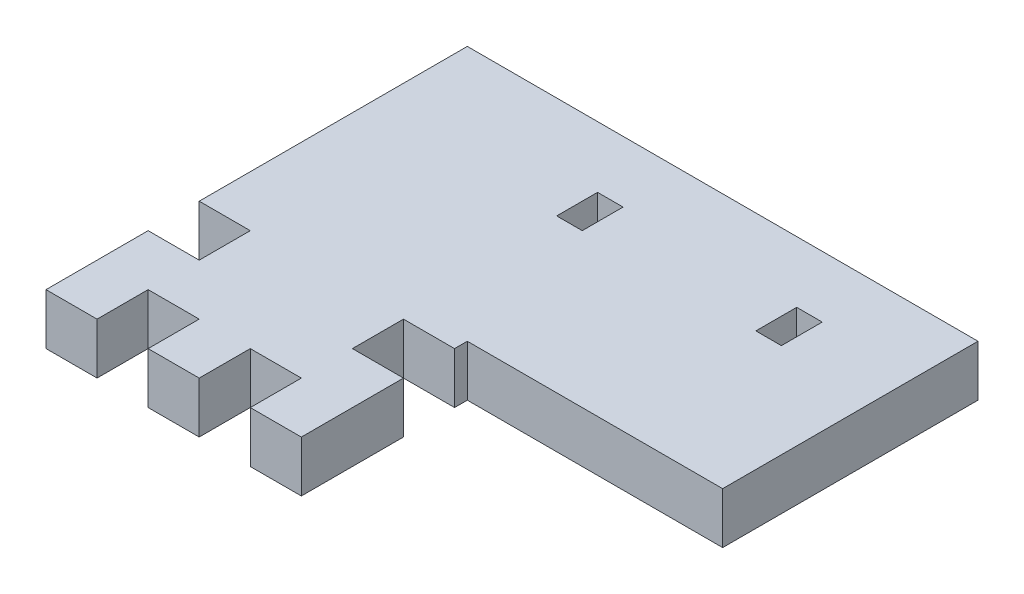
ISO-10303-21;
HEADER;
FILE_DESCRIPTION(('STEP AP214'),'2;1');
FILE_NAME('part.step','',(''),(''),'','','');
FILE_SCHEMA(('AUTOMOTIVE_DESIGN { 1 0 10303 214 1 1 1 1 }'));
ENDSEC;
DATA;
#1=APPLICATION_CONTEXT('core data for automotive mechanical design processes');
#2=APPLICATION_PROTOCOL_DEFINITION('international standard','automotive_design',2000,#1);
#3=PRODUCT_CONTEXT('',#1,'mechanical');
#4=PRODUCT('Part','Part','',(#3));
#5=PRODUCT_RELATED_PRODUCT_CATEGORY('part','',(#4));
#6=PRODUCT_DEFINITION_FORMATION('','',#4);
#7=PRODUCT_DEFINITION_CONTEXT('part definition',#1,'design');
#8=PRODUCT_DEFINITION('design','',#6,#7);
#9=PRODUCT_DEFINITION_SHAPE('','',#8);
#10=(LENGTH_UNIT() NAMED_UNIT(*) SI_UNIT(.MILLI.,.METRE.));
#11=(NAMED_UNIT(*) PLANE_ANGLE_UNIT() SI_UNIT($,.RADIAN.));
#12=(NAMED_UNIT(*) SI_UNIT($,.STERADIAN.) SOLID_ANGLE_UNIT());
#13=UNCERTAINTY_MEASURE_WITH_UNIT(LENGTH_MEASURE(1.E-05),#10,'distance_accuracy_value','');
#14=(GEOMETRIC_REPRESENTATION_CONTEXT(3) GLOBAL_UNCERTAINTY_ASSIGNED_CONTEXT((#13)) GLOBAL_UNIT_ASSIGNED_CONTEXT((#10,
#11,#12)) REPRESENTATION_CONTEXT('',''));
#15=CARTESIAN_POINT('',(0.,0.,0.));
#16=DIRECTION('',(0.,0.,1.));
#17=DIRECTION('',(1.,0.,0.));
#18=AXIS2_PLACEMENT_3D('',#15,#16,#17);
#19=CARTESIAN_POINT('',(12.7,2.54,-8.255));
#20=DIRECTION('',(-1.,0.,0.));
#21=DIRECTION('',(0.,0.,1.));
#22=AXIS2_PLACEMENT_3D('',#19,#20,#21);
#23=PLANE('',#22);
#24=DIRECTION('',(0.,0.,-1.));
#25=VECTOR('',#24,1.);
#26=CARTESIAN_POINT('',(12.7,0.,-8.255));
#27=LINE('',#26,#25);
#28=CARTESIAN_POINT('',(12.7,0.,0.));
#29=VERTEX_POINT('',#28);
#30=CARTESIAN_POINT('',(12.7,0.,-5.08));
#31=VERTEX_POINT('',#30);
#32=EDGE_CURVE('E255',#29,#31,#27,.T.);
#33=ORIENTED_EDGE('',*,*,#32,.T.);
#34=DIRECTION('',(0.,1.,0.));
#35=VECTOR('',#34,1.);
#36=CARTESIAN_POINT('',(12.7,0.,-5.08));
#37=LINE('',#36,#35);
#38=CARTESIAN_POINT('',(12.7,2.54,-5.08));
#39=VERTEX_POINT('',#38);
#40=EDGE_CURVE('E342',#31,#39,#37,.T.);
#41=ORIENTED_EDGE('',*,*,#40,.T.);
#42=DIRECTION('',(0.,0.,-1.));
#43=VECTOR('',#42,1.);
#44=CARTESIAN_POINT('',(12.7,2.54,-8.255));
#45=LINE('',#44,#43);
#46=CARTESIAN_POINT('',(12.7,2.54,0.));
#47=VERTEX_POINT('',#46);
#48=EDGE_CURVE('E295',#47,#39,#45,.T.);
#49=ORIENTED_EDGE('',*,*,#48,.F.);
#50=DIRECTION('',(0.,-1.,0.));
#51=VECTOR('',#50,1.);
#52=CARTESIAN_POINT('',(12.7,2.54,0.));
#53=LINE('',#52,#51);
#54=EDGE_CURVE('E11',#47,#29,#53,.T.);
#55=ORIENTED_EDGE('',*,*,#54,.T.);
#56=EDGE_LOOP('',(#33,#41,#49,#55));
#57=FACE_BOUND('',#56,.T.);
#58=ADVANCED_FACE('F33',(#57),#23,.F.);
#59=CARTESIAN_POINT('',(0.,2.54,0.));
#60=DIRECTION('',(1.,0.,0.));
#61=DIRECTION('',(0.,0.,-1.));
#62=AXIS2_PLACEMENT_3D('',#59,#60,#61);
#63=PLANE('',#62);
#64=DIRECTION('',(0.,0.,1.));
#65=VECTOR('',#64,1.);
#66=CARTESIAN_POINT('',(0.,0.,0.));
#67=LINE('',#66,#65);
#68=CARTESIAN_POINT('',(0.,0.,-20.955));
#69=VERTEX_POINT('',#68);
#70=CARTESIAN_POINT('',(0.,0.,-7.62));
#71=VERTEX_POINT('',#70);
#72=EDGE_CURVE('E271',#69,#71,#67,.T.);
#73=ORIENTED_EDGE('',*,*,#72,.T.);
#74=DIRECTION('',(0.,1.,0.));
#75=VECTOR('',#74,1.);
#76=CARTESIAN_POINT('',(0.,0.,-7.62));
#77=LINE('',#76,#75);
#78=CARTESIAN_POINT('',(0.,2.54,-7.62));
#79=VERTEX_POINT('',#78);
#80=EDGE_CURVE('E377',#71,#79,#77,.T.);
#81=ORIENTED_EDGE('',*,*,#80,.T.);
#82=DIRECTION('',(0.,0.,1.));
#83=VECTOR('',#82,1.);
#84=CARTESIAN_POINT('',(0.,2.54,0.));
#85=LINE('',#84,#83);
#86=CARTESIAN_POINT('',(0.,2.54,-20.955));
#87=VERTEX_POINT('',#86);
#88=EDGE_CURVE('E279',#87,#79,#85,.T.);
#89=ORIENTED_EDGE('',*,*,#88,.F.);
#90=DIRECTION('',(0.,-1.,0.));
#91=VECTOR('',#90,1.);
#92=CARTESIAN_POINT('',(0.,2.54,-20.955));
#93=LINE('',#92,#91);
#94=EDGE_CURVE('E278',#87,#69,#93,.T.);
#95=ORIENTED_EDGE('',*,*,#94,.T.);
#96=EDGE_LOOP('',(#73,#81,#89,#95));
#97=FACE_BOUND('',#96,.T.);
#98=ADVANCED_FACE('F525',(#97),#63,.F.);
#99=CARTESIAN_POINT('',(12.7,2.54,0.));
#100=DIRECTION('',(0.,0.,-1.));
#101=DIRECTION('',(-1.,0.,0.));
#102=AXIS2_PLACEMENT_3D('',#99,#100,#101);
#103=PLANE('',#102);
#104=DIRECTION('',(1.,0.,0.));
#105=VECTOR('',#104,1.);
#106=CARTESIAN_POINT('',(12.7,0.,0.));
#107=LINE('',#106,#105);
#108=CARTESIAN_POINT('',(5.08,0.,0.));
#109=VERTEX_POINT('',#108);
#110=CARTESIAN_POINT('',(7.62,0.,0.));
#111=VERTEX_POINT('',#110);
#112=EDGE_CURVE('E260',#109,#111,#107,.T.);
#113=ORIENTED_EDGE('',*,*,#112,.T.);
#114=DIRECTION('',(0.,1.,0.));
#115=VECTOR('',#114,1.);
#116=CARTESIAN_POINT('',(7.62,0.,0.));
#117=LINE('',#116,#115);
#118=CARTESIAN_POINT('',(7.62,2.54,0.));
#119=VERTEX_POINT('',#118);
#120=EDGE_CURVE('E459',#111,#119,#117,.T.);
#121=ORIENTED_EDGE('',*,*,#120,.T.);
#122=DIRECTION('',(1.,0.,0.));
#123=VECTOR('',#122,1.);
#124=CARTESIAN_POINT('',(12.7,2.54,0.));
#125=LINE('',#124,#123);
#126=CARTESIAN_POINT('',(5.08,2.54,0.));
#127=VERTEX_POINT('',#126);
#128=EDGE_CURVE('E327',#127,#119,#125,.T.);
#129=ORIENTED_EDGE('',*,*,#128,.F.);
#130=DIRECTION('',(0.,1.,0.));
#131=VECTOR('',#130,1.);
#132=CARTESIAN_POINT('',(5.08,0.,0.));
#133=LINE('',#132,#131);
#134=EDGE_CURVE('E491',#109,#127,#133,.T.);
#135=ORIENTED_EDGE('',*,*,#134,.F.);
#136=EDGE_LOOP('',(#113,#121,#129,#135));
#137=FACE_BOUND('',#136,.T.);
#138=ADVANCED_FACE('F503',(#137),#103,.F.);
#139=CARTESIAN_POINT('',(0.,0.,0.));
#140=VERTEX_POINT('',#139);
#141=CARTESIAN_POINT('',(2.54,0.,0.));
#142=VERTEX_POINT('',#141);
#143=EDGE_CURVE('E256',#140,#142,#107,.T.);
#144=ORIENTED_EDGE('',*,*,#143,.T.);
#145=DIRECTION('',(0.,1.,0.));
#146=VECTOR('',#145,1.);
#147=CARTESIAN_POINT('',(2.54,0.,0.));
#148=LINE('',#147,#146);
#149=CARTESIAN_POINT('',(2.54,2.54,0.));
#150=VERTEX_POINT('',#149);
#151=EDGE_CURVE('E326',#142,#150,#148,.T.);
#152=ORIENTED_EDGE('',*,*,#151,.T.);
#153=CARTESIAN_POINT('',(0.,2.54,0.));
#154=VERTEX_POINT('',#153);
#155=EDGE_CURVE('E314',#154,#150,#125,.T.);
#156=ORIENTED_EDGE('',*,*,#155,.F.);
#157=DIRECTION('',(0.,-1.,0.));
#158=VECTOR('',#157,1.);
#159=CARTESIAN_POINT('',(0.,2.54,0.));
#160=LINE('',#159,#158);
#161=EDGE_CURVE('E275',#154,#140,#160,.T.);
#162=ORIENTED_EDGE('',*,*,#161,.T.);
#163=EDGE_LOOP('',(#144,#152,#156,#162));
#164=FACE_BOUND('',#163,.T.);
#165=ADVANCED_FACE('F325',(#164),#103,.F.);
#166=CARTESIAN_POINT('',(10.16,2.54,0.));
#167=VERTEX_POINT('',#166);
#168=EDGE_CURVE('E274',#167,#47,#125,.T.);
#169=ORIENTED_EDGE('',*,*,#168,.F.);
#170=DIRECTION('',(0.,1.,0.));
#171=VECTOR('',#170,1.);
#172=CARTESIAN_POINT('',(10.16,0.,0.));
#173=LINE('',#172,#171);
#174=CARTESIAN_POINT('',(10.16,0.,0.));
#175=VERTEX_POINT('',#174);
#176=EDGE_CURVE('E345',#175,#167,#173,.T.);
#177=ORIENTED_EDGE('',*,*,#176,.F.);
#178=EDGE_CURVE('E262',#175,#29,#107,.T.);
#179=ORIENTED_EDGE('',*,*,#178,.T.);
#180=ORIENTED_EDGE('',*,*,#54,.F.);
#181=EDGE_LOOP('',(#169,#177,#179,#180));
#182=FACE_BOUND('',#181,.T.);
#183=ADVANCED_FACE('F35',(#182),#103,.F.);
#184=CARTESIAN_POINT('',(12.7,2.54,-7.62));
#185=VERTEX_POINT('',#184);
#186=CARTESIAN_POINT('',(12.7,2.54,-8.255));
#187=VERTEX_POINT('',#186);
#188=EDGE_CURVE('E246',#185,#187,#45,.T.);
#189=ORIENTED_EDGE('',*,*,#188,.F.);
#190=DIRECTION('',(0.,1.,0.));
#191=VECTOR('',#190,1.);
#192=CARTESIAN_POINT('',(12.7,0.,-7.62));
#193=LINE('',#192,#191);
#194=CARTESIAN_POINT('',(12.7,0.,-7.62));
#195=VERTEX_POINT('',#194);
#196=EDGE_CURVE('E233',#195,#185,#193,.T.);
#197=ORIENTED_EDGE('',*,*,#196,.F.);
#198=CARTESIAN_POINT('',(12.7,0.,-8.255));
#199=VERTEX_POINT('',#198);
#200=EDGE_CURVE('E244',#195,#199,#27,.T.);
#201=ORIENTED_EDGE('',*,*,#200,.T.);
#202=DIRECTION('',(0.,-1.,0.));
#203=VECTOR('',#202,1.);
#204=CARTESIAN_POINT('',(12.7,2.54,-8.255));
#205=LINE('',#204,#203);
#206=EDGE_CURVE('E41',#187,#199,#205,.T.);
#207=ORIENTED_EDGE('',*,*,#206,.F.);
#208=EDGE_LOOP('',(#189,#197,#201,#207));
#209=FACE_BOUND('',#208,.T.);
#210=ADVANCED_FACE('F242',(#209),#23,.F.);
#211=CARTESIAN_POINT('',(25.4,2.54,-8.255));
#212=DIRECTION('',(0.,0.,-1.));
#213=DIRECTION('',(-1.,0.,0.));
#214=AXIS2_PLACEMENT_3D('',#211,#212,#213);
#215=PLANE('',#214);
#216=DIRECTION('',(1.,0.,0.));
#217=VECTOR('',#216,1.);
#218=CARTESIAN_POINT('',(25.4,0.,-8.255));
#219=LINE('',#218,#217);
#220=CARTESIAN_POINT('',(25.4,0.,-8.255));
#221=VERTEX_POINT('',#220);
#222=EDGE_CURVE('E254',#199,#221,#219,.T.);
#223=ORIENTED_EDGE('',*,*,#222,.T.);
#224=DIRECTION('',(0.,-1.,0.));
#225=VECTOR('',#224,1.);
#226=CARTESIAN_POINT('',(25.4,2.54,-8.255));
#227=LINE('',#226,#225);
#228=CARTESIAN_POINT('',(25.4,2.54,-8.255));
#229=VERTEX_POINT('',#228);
#230=EDGE_CURVE('E285',#229,#221,#227,.T.);
#231=ORIENTED_EDGE('',*,*,#230,.F.);
#232=DIRECTION('',(1.,0.,0.));
#233=VECTOR('',#232,1.);
#234=CARTESIAN_POINT('',(25.4,2.54,-8.255));
#235=LINE('',#234,#233);
#236=EDGE_CURVE('E291',#187,#229,#235,.T.);
#237=ORIENTED_EDGE('',*,*,#236,.F.);
#238=ORIENTED_EDGE('',*,*,#206,.T.);
#239=EDGE_LOOP('',(#223,#231,#237,#238));
#240=FACE_BOUND('',#239,.T.);
#241=ADVANCED_FACE('F289',(#240),#215,.F.);
#242=CARTESIAN_POINT('',(25.4,2.54,-20.955));
#243=DIRECTION('',(-1.,0.,0.));
#244=DIRECTION('',(0.,0.,1.));
#245=AXIS2_PLACEMENT_3D('',#242,#243,#244);
#246=PLANE('',#245);
#247=DIRECTION('',(0.,0.,-1.));
#248=VECTOR('',#247,1.);
#249=CARTESIAN_POINT('',(25.4,0.,-20.955));
#250=LINE('',#249,#248);
#251=CARTESIAN_POINT('',(25.4,0.,-20.955));
#252=VERTEX_POINT('',#251);
#253=EDGE_CURVE('E266',#221,#252,#250,.T.);
#254=ORIENTED_EDGE('',*,*,#253,.T.);
#255=DIRECTION('',(0.,-1.,0.));
#256=VECTOR('',#255,1.);
#257=CARTESIAN_POINT('',(25.4,2.54,-20.955));
#258=LINE('',#257,#256);
#259=CARTESIAN_POINT('',(25.4,2.54,-20.955));
#260=VERTEX_POINT('',#259);
#261=EDGE_CURVE('E282',#260,#252,#258,.T.);
#262=ORIENTED_EDGE('',*,*,#261,.F.);
#263=DIRECTION('',(0.,0.,-1.));
#264=VECTOR('',#263,1.);
#265=CARTESIAN_POINT('',(25.4,2.54,-20.955));
#266=LINE('',#265,#264);
#267=EDGE_CURVE('E294',#229,#260,#266,.T.);
#268=ORIENTED_EDGE('',*,*,#267,.F.);
#269=ORIENTED_EDGE('',*,*,#230,.T.);
#270=EDGE_LOOP('',(#254,#262,#268,#269));
#271=FACE_BOUND('',#270,.T.);
#272=ADVANCED_FACE('F537',(#271),#246,.F.);
#273=CARTESIAN_POINT('',(0.,2.54,-20.955));
#274=DIRECTION('',(0.,0.,1.));
#275=DIRECTION('',(1.,0.,0.));
#276=AXIS2_PLACEMENT_3D('',#273,#274,#275);
#277=PLANE('',#276);
#278=DIRECTION('',(-1.,0.,0.));
#279=VECTOR('',#278,1.);
#280=CARTESIAN_POINT('',(0.,0.,-20.955));
#281=LINE('',#280,#279);
#282=EDGE_CURVE('E268',#252,#69,#281,.T.);
#283=ORIENTED_EDGE('',*,*,#282,.T.);
#284=ORIENTED_EDGE('',*,*,#94,.F.);
#285=DIRECTION('',(-1.,0.,0.));
#286=VECTOR('',#285,1.);
#287=CARTESIAN_POINT('',(0.,2.54,-20.955));
#288=LINE('',#287,#286);
#289=EDGE_CURVE('E297',#260,#87,#288,.T.);
#290=ORIENTED_EDGE('',*,*,#289,.F.);
#291=ORIENTED_EDGE('',*,*,#261,.T.);
#292=EDGE_LOOP('',(#283,#284,#290,#291));
#293=FACE_BOUND('',#292,.T.);
#294=ADVANCED_FACE('F573',(#293),#277,.F.);
#295=CARTESIAN_POINT('',(0.,2.54,-5.08));
#296=VERTEX_POINT('',#295);
#297=EDGE_CURVE('E303',#296,#154,#85,.T.);
#298=ORIENTED_EDGE('',*,*,#297,.F.);
#299=DIRECTION('',(0.,1.,0.));
#300=VECTOR('',#299,1.);
#301=CARTESIAN_POINT('',(0.,0.,-5.08));
#302=LINE('',#301,#300);
#303=CARTESIAN_POINT('',(0.,0.,-5.08));
#304=VERTEX_POINT('',#303);
#305=EDGE_CURVE('E371',#304,#296,#302,.T.);
#306=ORIENTED_EDGE('',*,*,#305,.F.);
#307=EDGE_CURVE('E270',#304,#140,#67,.T.);
#308=ORIENTED_EDGE('',*,*,#307,.T.);
#309=ORIENTED_EDGE('',*,*,#161,.F.);
#310=EDGE_LOOP('',(#298,#306,#308,#309));
#311=FACE_BOUND('',#310,.T.);
#312=ADVANCED_FACE('F320',(#311),#63,.F.);
#313=CARTESIAN_POINT('',(0.,2.54,0.));
#314=DIRECTION('',(0.,-1.,0.));
#315=DIRECTION('',(0.,0.,-1.));
#316=AXIS2_PLACEMENT_3D('',#313,#314,#315);
#317=PLANE('',#316);
#318=DIRECTION('',(1.,0.,0.));
#319=VECTOR('',#318,1.);
#320=CARTESIAN_POINT('',(19.431,2.54,-15.875));
#321=LINE('',#320,#319);
#322=CARTESIAN_POINT('',(19.431,2.54,-15.875));
#323=VERTEX_POINT('',#322);
#324=CARTESIAN_POINT('',(20.701,2.54,-15.875));
#325=VERTEX_POINT('',#324);
#326=EDGE_CURVE('E401',#323,#325,#321,.T.);
#327=ORIENTED_EDGE('',*,*,#326,.F.);
#328=DIRECTION('',(0.,0.,1.));
#329=VECTOR('',#328,1.);
#330=CARTESIAN_POINT('',(19.431,2.54,-15.875));
#331=LINE('',#330,#329);
#332=CARTESIAN_POINT('',(19.431,2.54,-17.907));
#333=VERTEX_POINT('',#332);
#334=EDGE_CURVE('E380',#333,#323,#331,.T.);
#335=ORIENTED_EDGE('',*,*,#334,.F.);
#336=DIRECTION('',(-1.,0.,0.));
#337=VECTOR('',#336,1.);
#338=CARTESIAN_POINT('',(19.431,2.54,-17.907));
#339=LINE('',#338,#337);
#340=CARTESIAN_POINT('',(20.701,2.54,-17.907));
#341=VERTEX_POINT('',#340);
#342=EDGE_CURVE('E390',#341,#333,#339,.T.);
#343=ORIENTED_EDGE('',*,*,#342,.F.);
#344=DIRECTION('',(0.,0.,-1.));
#345=VECTOR('',#344,1.);
#346=CARTESIAN_POINT('',(20.701,2.54,-15.875));
#347=LINE('',#346,#345);
#348=EDGE_CURVE('E404',#325,#341,#347,.T.);
#349=ORIENTED_EDGE('',*,*,#348,.F.);
#350=EDGE_LOOP('',(#327,#335,#343,#349));
#351=FACE_BOUND('',#350,.T.);
#352=DIRECTION('',(1.,0.,0.));
#353=VECTOR('',#352,1.);
#354=CARTESIAN_POINT('',(9.525,2.54,-15.875));
#355=LINE('',#354,#353);
#356=CARTESIAN_POINT('',(9.525,2.54,-15.875));
#357=VERTEX_POINT('',#356);
#358=CARTESIAN_POINT('',(10.795,2.54,-15.875));
#359=VERTEX_POINT('',#358);
#360=EDGE_CURVE('E433',#357,#359,#355,.T.);
#361=ORIENTED_EDGE('',*,*,#360,.F.);
#362=DIRECTION('',(0.,0.,1.));
#363=VECTOR('',#362,1.);
#364=CARTESIAN_POINT('',(9.525,2.54,-15.875));
#365=LINE('',#364,#363);
#366=CARTESIAN_POINT('',(9.525,2.54,-17.907));
#367=VERTEX_POINT('',#366);
#368=EDGE_CURVE('E411',#367,#357,#365,.T.);
#369=ORIENTED_EDGE('',*,*,#368,.F.);
#370=DIRECTION('',(-1.,0.,0.));
#371=VECTOR('',#370,1.);
#372=CARTESIAN_POINT('',(9.525,2.54,-17.907));
#373=LINE('',#372,#371);
#374=CARTESIAN_POINT('',(10.795,2.54,-17.907));
#375=VERTEX_POINT('',#374);
#376=EDGE_CURVE('E422',#375,#367,#373,.T.);
#377=ORIENTED_EDGE('',*,*,#376,.F.);
#378=DIRECTION('',(0.,0.,-1.));
#379=VECTOR('',#378,1.);
#380=CARTESIAN_POINT('',(10.795,2.54,-15.875));
#381=LINE('',#380,#379);
#382=EDGE_CURVE('E436',#359,#375,#381,.T.);
#383=ORIENTED_EDGE('',*,*,#382,.F.);
#384=EDGE_LOOP('',(#361,#369,#377,#383));
#385=FACE_BOUND('',#384,.T.);
#386=ORIENTED_EDGE('',*,*,#48,.T.);
#387=DIRECTION('',(1.,0.,0.));
#388=VECTOR('',#387,1.);
#389=CARTESIAN_POINT('',(12.7,2.54,-5.08));
#390=LINE('',#389,#388);
#391=CARTESIAN_POINT('',(10.16,2.54,-5.08));
#392=VERTEX_POINT('',#391);
#393=EDGE_CURVE('E238',#392,#39,#390,.T.);
#394=ORIENTED_EDGE('',*,*,#393,.F.);
#395=DIRECTION('',(0.,0.,1.));
#396=VECTOR('',#395,1.);
#397=CARTESIAN_POINT('',(10.16,2.54,-7.62));
#398=LINE('',#397,#396);
#399=CARTESIAN_POINT('',(10.16,2.54,-7.62));
#400=VERTEX_POINT('',#399);
#401=EDGE_CURVE('E355',#400,#392,#398,.T.);
#402=ORIENTED_EDGE('',*,*,#401,.F.);
#403=DIRECTION('',(-1.,0.,0.));
#404=VECTOR('',#403,1.);
#405=CARTESIAN_POINT('',(12.7,2.54,-7.62));
#406=LINE('',#405,#404);
#407=EDGE_CURVE('E353',#185,#400,#406,.T.);
#408=ORIENTED_EDGE('',*,*,#407,.F.);
#409=ORIENTED_EDGE('',*,*,#188,.T.);
#410=ORIENTED_EDGE('',*,*,#236,.T.);
#411=ORIENTED_EDGE('',*,*,#267,.T.);
#412=ORIENTED_EDGE('',*,*,#289,.T.);
#413=ORIENTED_EDGE('',*,*,#88,.T.);
#414=DIRECTION('',(-1.,0.,0.));
#415=VECTOR('',#414,1.);
#416=CARTESIAN_POINT('',(0.,2.54,-7.62));
#417=LINE('',#416,#415);
#418=CARTESIAN_POINT('',(2.54,2.54,-7.62));
#419=VERTEX_POINT('',#418);
#420=EDGE_CURVE('E366',#419,#79,#417,.T.);
#421=ORIENTED_EDGE('',*,*,#420,.F.);
#422=DIRECTION('',(0.,0.,-1.));
#423=VECTOR('',#422,1.);
#424=CARTESIAN_POINT('',(2.54,2.54,-7.62));
#425=LINE('',#424,#423);
#426=CARTESIAN_POINT('',(2.54,2.54,-5.08));
#427=VERTEX_POINT('',#426);
#428=EDGE_CURVE('E373',#427,#419,#425,.T.);
#429=ORIENTED_EDGE('',*,*,#428,.F.);
#430=DIRECTION('',(1.,0.,0.));
#431=VECTOR('',#430,1.);
#432=CARTESIAN_POINT('',(0.,2.54,-5.08));
#433=LINE('',#432,#431);
#434=EDGE_CURVE('E317',#296,#427,#433,.T.);
#435=ORIENTED_EDGE('',*,*,#434,.F.);
#436=ORIENTED_EDGE('',*,*,#297,.T.);
#437=ORIENTED_EDGE('',*,*,#155,.T.);
#438=DIRECTION('',(0.,0.,1.));
#439=VECTOR('',#438,1.);
#440=CARTESIAN_POINT('',(2.54,2.54,0.));
#441=LINE('',#440,#439);
#442=CARTESIAN_POINT('',(2.54,2.54,-2.54));
#443=VERTEX_POINT('',#442);
#444=EDGE_CURVE('E466',#443,#150,#441,.T.);
#445=ORIENTED_EDGE('',*,*,#444,.F.);
#446=DIRECTION('',(-1.,0.,0.));
#447=VECTOR('',#446,1.);
#448=CARTESIAN_POINT('',(2.54,2.54,-2.54));
#449=LINE('',#448,#447);
#450=CARTESIAN_POINT('',(5.08,2.54,-2.54));
#451=VERTEX_POINT('',#450);
#452=EDGE_CURVE('E476',#451,#443,#449,.T.);
#453=ORIENTED_EDGE('',*,*,#452,.F.);
#454=DIRECTION('',(0.,0.,-1.));
#455=VECTOR('',#454,1.);
#456=CARTESIAN_POINT('',(5.08,2.54,0.));
#457=LINE('',#456,#455);
#458=EDGE_CURVE('E483',#127,#451,#457,.T.);
#459=ORIENTED_EDGE('',*,*,#458,.F.);
#460=ORIENTED_EDGE('',*,*,#128,.T.);
#461=DIRECTION('',(0.,0.,1.));
#462=VECTOR('',#461,1.);
#463=CARTESIAN_POINT('',(7.62,2.54,0.));
#464=LINE('',#463,#462);
#465=CARTESIAN_POINT('',(7.62,2.54,-2.54));
#466=VERTEX_POINT('',#465);
#467=EDGE_CURVE('E443',#466,#119,#464,.T.);
#468=ORIENTED_EDGE('',*,*,#467,.F.);
#469=DIRECTION('',(-1.,0.,0.));
#470=VECTOR('',#469,1.);
#471=CARTESIAN_POINT('',(7.62,2.54,-2.54));
#472=LINE('',#471,#470);
#473=CARTESIAN_POINT('',(10.16,2.54,-2.54));
#474=VERTEX_POINT('',#473);
#475=EDGE_CURVE('E454',#474,#466,#472,.T.);
#476=ORIENTED_EDGE('',*,*,#475,.F.);
#477=DIRECTION('',(0.,0.,-1.));
#478=VECTOR('',#477,1.);
#479=CARTESIAN_POINT('',(10.16,2.54,0.));
#480=LINE('',#479,#478);
#481=EDGE_CURVE('E336',#167,#474,#480,.T.);
#482=ORIENTED_EDGE('',*,*,#481,.F.);
#483=ORIENTED_EDGE('',*,*,#168,.T.);
#484=EDGE_LOOP('',(#386,#394,#402,#408,#409,#410,#411,#412,#413,#421,#429,#435,#436,#437,#445,
#453,#459,#460,#468,#476,#482,#483));
#485=FACE_BOUND('',#484,.T.);
#486=ADVANCED_FACE('F311',(#351,#385,#485),#317,.F.);
#487=CARTESIAN_POINT('',(0.,0.,0.));
#488=DIRECTION('',(0.,-1.,0.));
#489=DIRECTION('',(0.,0.,-1.));
#490=AXIS2_PLACEMENT_3D('',#487,#488,#489);
#491=PLANE('',#490);
#492=DIRECTION('',(1.,0.,0.));
#493=VECTOR('',#492,1.);
#494=CARTESIAN_POINT('',(12.7,0.,-5.08));
#495=LINE('',#494,#493);
#496=CARTESIAN_POINT('',(10.16,0.,-5.08));
#497=VERTEX_POINT('',#496);
#498=EDGE_CURVE('E247',#497,#31,#495,.T.);
#499=ORIENTED_EDGE('',*,*,#498,.T.);
#500=ORIENTED_EDGE('',*,*,#32,.F.);
#501=ORIENTED_EDGE('',*,*,#178,.F.);
#502=DIRECTION('',(0.,0.,-1.));
#503=VECTOR('',#502,1.);
#504=CARTESIAN_POINT('',(10.16,0.,0.));
#505=LINE('',#504,#503);
#506=CARTESIAN_POINT('',(10.16,0.,-2.54));
#507=VERTEX_POINT('',#506);
#508=EDGE_CURVE('E453',#175,#507,#505,.T.);
#509=ORIENTED_EDGE('',*,*,#508,.T.);
#510=DIRECTION('',(-1.,0.,0.));
#511=VECTOR('',#510,1.);
#512=CARTESIAN_POINT('',(7.62,0.,-2.54));
#513=LINE('',#512,#511);
#514=CARTESIAN_POINT('',(7.62,0.,-2.54));
#515=VERTEX_POINT('',#514);
#516=EDGE_CURVE('E456',#507,#515,#513,.T.);
#517=ORIENTED_EDGE('',*,*,#516,.T.);
#518=DIRECTION('',(0.,0.,1.));
#519=VECTOR('',#518,1.);
#520=CARTESIAN_POINT('',(7.62,0.,0.));
#521=LINE('',#520,#519);
#522=EDGE_CURVE('E450',#515,#111,#521,.T.);
#523=ORIENTED_EDGE('',*,*,#522,.T.);
#524=ORIENTED_EDGE('',*,*,#112,.F.);
#525=DIRECTION('',(0.,0.,-1.));
#526=VECTOR('',#525,1.);
#527=CARTESIAN_POINT('',(5.08,0.,0.));
#528=LINE('',#527,#526);
#529=CARTESIAN_POINT('',(5.08,0.,-2.54));
#530=VERTEX_POINT('',#529);
#531=EDGE_CURVE('E475',#109,#530,#528,.T.);
#532=ORIENTED_EDGE('',*,*,#531,.T.);
#533=DIRECTION('',(-1.,0.,0.));
#534=VECTOR('',#533,1.);
#535=CARTESIAN_POINT('',(2.54,0.,-2.54));
#536=LINE('',#535,#534);
#537=CARTESIAN_POINT('',(2.54,0.,-2.54));
#538=VERTEX_POINT('',#537);
#539=EDGE_CURVE('E479',#530,#538,#536,.T.);
#540=ORIENTED_EDGE('',*,*,#539,.T.);
#541=DIRECTION('',(0.,0.,1.));
#542=VECTOR('',#541,1.);
#543=CARTESIAN_POINT('',(2.54,0.,0.));
#544=LINE('',#543,#542);
#545=EDGE_CURVE('E472',#538,#142,#544,.T.);
#546=ORIENTED_EDGE('',*,*,#545,.T.);
#547=ORIENTED_EDGE('',*,*,#143,.F.);
#548=ORIENTED_EDGE('',*,*,#307,.F.);
#549=DIRECTION('',(1.,0.,0.));
#550=VECTOR('',#549,1.);
#551=CARTESIAN_POINT('',(0.,0.,-5.08));
#552=LINE('',#551,#550);
#553=CARTESIAN_POINT('',(2.54,0.,-5.08));
#554=VERTEX_POINT('',#553);
#555=EDGE_CURVE('E363',#304,#554,#552,.T.);
#556=ORIENTED_EDGE('',*,*,#555,.T.);
#557=DIRECTION('',(0.,0.,-1.));
#558=VECTOR('',#557,1.);
#559=CARTESIAN_POINT('',(2.54,0.,-7.62));
#560=LINE('',#559,#558);
#561=CARTESIAN_POINT('',(2.54,0.,-7.62));
#562=VERTEX_POINT('',#561);
#563=EDGE_CURVE('E56',#554,#562,#560,.T.);
#564=ORIENTED_EDGE('',*,*,#563,.T.);
#565=DIRECTION('',(-1.,0.,0.));
#566=VECTOR('',#565,1.);
#567=CARTESIAN_POINT('',(0.,0.,-7.62));
#568=LINE('',#567,#566);
#569=EDGE_CURVE('E368',#562,#71,#568,.T.);
#570=ORIENTED_EDGE('',*,*,#569,.T.);
#571=ORIENTED_EDGE('',*,*,#72,.F.);
#572=ORIENTED_EDGE('',*,*,#282,.F.);
#573=ORIENTED_EDGE('',*,*,#253,.F.);
#574=ORIENTED_EDGE('',*,*,#222,.F.);
#575=ORIENTED_EDGE('',*,*,#200,.F.);
#576=DIRECTION('',(-1.,0.,0.));
#577=VECTOR('',#576,1.);
#578=CARTESIAN_POINT('',(12.7,0.,-7.62));
#579=LINE('',#578,#577);
#580=CARTESIAN_POINT('',(10.16,0.,-7.62));
#581=VERTEX_POINT('',#580);
#582=EDGE_CURVE('E229',#195,#581,#579,.T.);
#583=ORIENTED_EDGE('',*,*,#582,.T.);
#584=DIRECTION('',(0.,0.,1.));
#585=VECTOR('',#584,1.);
#586=CARTESIAN_POINT('',(10.16,0.,-7.62));
#587=LINE('',#586,#585);
#588=EDGE_CURVE('E48',#581,#497,#587,.T.);
#589=ORIENTED_EDGE('',*,*,#588,.T.);
#590=EDGE_LOOP('',(#499,#500,#501,#509,#517,#523,#524,#532,#540,#546,#547,#548,#556,#564,#570,
#571,#572,#573,#574,#575,#583,#589));
#591=FACE_BOUND('',#590,.T.);
#592=DIRECTION('',(0.,0.,1.));
#593=VECTOR('',#592,1.);
#594=CARTESIAN_POINT('',(19.431,0.,-15.875));
#595=LINE('',#594,#593);
#596=CARTESIAN_POINT('',(19.431,0.,-17.907));
#597=VERTEX_POINT('',#596);
#598=CARTESIAN_POINT('',(19.431,0.,-15.875));
#599=VERTEX_POINT('',#598);
#600=EDGE_CURVE('E386',#597,#599,#595,.T.);
#601=ORIENTED_EDGE('',*,*,#600,.T.);
#602=DIRECTION('',(1.,0.,0.));
#603=VECTOR('',#602,1.);
#604=CARTESIAN_POINT('',(19.431,0.,-15.875));
#605=LINE('',#604,#603);
#606=CARTESIAN_POINT('',(20.701,0.,-15.875));
#607=VERTEX_POINT('',#606);
#608=EDGE_CURVE('E389',#599,#607,#605,.T.);
#609=ORIENTED_EDGE('',*,*,#608,.T.);
#610=DIRECTION('',(0.,0.,-1.));
#611=VECTOR('',#610,1.);
#612=CARTESIAN_POINT('',(20.701,0.,-15.875));
#613=LINE('',#612,#611);
#614=CARTESIAN_POINT('',(20.701,0.,-17.907));
#615=VERTEX_POINT('',#614);
#616=EDGE_CURVE('E393',#607,#615,#613,.T.);
#617=ORIENTED_EDGE('',*,*,#616,.T.);
#618=DIRECTION('',(-1.,0.,0.));
#619=VECTOR('',#618,1.);
#620=CARTESIAN_POINT('',(19.431,0.,-17.907));
#621=LINE('',#620,#619);
#622=EDGE_CURVE('E396',#615,#597,#621,.T.);
#623=ORIENTED_EDGE('',*,*,#622,.T.);
#624=EDGE_LOOP('',(#601,#609,#617,#623));
#625=FACE_BOUND('',#624,.T.);
#626=DIRECTION('',(0.,0.,1.));
#627=VECTOR('',#626,1.);
#628=CARTESIAN_POINT('',(9.525,0.,-15.875));
#629=LINE('',#628,#627);
#630=CARTESIAN_POINT('',(9.525,0.,-17.907));
#631=VERTEX_POINT('',#630);
#632=CARTESIAN_POINT('',(9.525,0.,-15.875));
#633=VERTEX_POINT('',#632);
#634=EDGE_CURVE('E418',#631,#633,#629,.T.);
#635=ORIENTED_EDGE('',*,*,#634,.T.);
#636=DIRECTION('',(1.,0.,0.));
#637=VECTOR('',#636,1.);
#638=CARTESIAN_POINT('',(9.525,0.,-15.875));
#639=LINE('',#638,#637);
#640=CARTESIAN_POINT('',(10.795,0.,-15.875));
#641=VERTEX_POINT('',#640);
#642=EDGE_CURVE('E421',#633,#641,#639,.T.);
#643=ORIENTED_EDGE('',*,*,#642,.T.);
#644=DIRECTION('',(0.,0.,-1.));
#645=VECTOR('',#644,1.);
#646=CARTESIAN_POINT('',(10.795,0.,-15.875));
#647=LINE('',#646,#645);
#648=CARTESIAN_POINT('',(10.795,0.,-17.907));
#649=VERTEX_POINT('',#648);
#650=EDGE_CURVE('E425',#641,#649,#647,.T.);
#651=ORIENTED_EDGE('',*,*,#650,.T.);
#652=DIRECTION('',(-1.,0.,0.));
#653=VECTOR('',#652,1.);
#654=CARTESIAN_POINT('',(9.525,0.,-17.907));
#655=LINE('',#654,#653);
#656=EDGE_CURVE('E428',#649,#631,#655,.T.);
#657=ORIENTED_EDGE('',*,*,#656,.T.);
#658=EDGE_LOOP('',(#635,#643,#651,#657));
#659=FACE_BOUND('',#658,.T.);
#660=ADVANCED_FACE('F251',(#591,#625,#659),#491,.T.);
#661=CARTESIAN_POINT('',(2.54,0.,0.));
#662=DIRECTION('',(-1.,0.,0.));
#663=DIRECTION('',(0.,0.,1.));
#664=AXIS2_PLACEMENT_3D('',#661,#662,#663);
#665=PLANE('',#664);
#666=ORIENTED_EDGE('',*,*,#444,.T.);
#667=ORIENTED_EDGE('',*,*,#151,.F.);
#668=ORIENTED_EDGE('',*,*,#545,.F.);
#669=DIRECTION('',(0.,1.,0.));
#670=VECTOR('',#669,1.);
#671=CARTESIAN_POINT('',(2.54,0.,-2.54));
#672=LINE('',#671,#670);
#673=EDGE_CURVE('E347',#538,#443,#672,.T.);
#674=ORIENTED_EDGE('',*,*,#673,.T.);
#675=EDGE_LOOP('',(#666,#667,#668,#674));
#676=FACE_BOUND('',#675,.T.);
#677=ADVANCED_FACE('F558',(#676),#665,.F.);
#678=CARTESIAN_POINT('',(2.54,0.,-2.54));
#679=DIRECTION('',(0.,0.,-1.));
#680=DIRECTION('',(-1.,0.,0.));
#681=AXIS2_PLACEMENT_3D('',#678,#679,#680);
#682=PLANE('',#681);
#683=ORIENTED_EDGE('',*,*,#452,.T.);
#684=ORIENTED_EDGE('',*,*,#673,.F.);
#685=ORIENTED_EDGE('',*,*,#539,.F.);
#686=DIRECTION('',(0.,1.,0.));
#687=VECTOR('',#686,1.);
#688=CARTESIAN_POINT('',(5.08,0.,-2.54));
#689=LINE('',#688,#687);
#690=EDGE_CURVE('E489',#530,#451,#689,.T.);
#691=ORIENTED_EDGE('',*,*,#690,.T.);
#692=EDGE_LOOP('',(#683,#684,#685,#691));
#693=FACE_BOUND('',#692,.T.);
#694=ADVANCED_FACE('F598',(#693),#682,.F.);
#695=CARTESIAN_POINT('',(5.08,0.,0.));
#696=DIRECTION('',(1.,0.,0.));
#697=DIRECTION('',(0.,0.,-1.));
#698=AXIS2_PLACEMENT_3D('',#695,#696,#697);
#699=PLANE('',#698);
#700=ORIENTED_EDGE('',*,*,#458,.T.);
#701=ORIENTED_EDGE('',*,*,#690,.F.);
#702=ORIENTED_EDGE('',*,*,#531,.F.);
#703=ORIENTED_EDGE('',*,*,#134,.T.);
#704=EDGE_LOOP('',(#700,#701,#702,#703));
#705=FACE_BOUND('',#704,.T.);
#706=ADVANCED_FACE('F495',(#705),#699,.F.);
#707=CARTESIAN_POINT('',(7.62,0.,0.));
#708=DIRECTION('',(-1.,0.,0.));
#709=DIRECTION('',(0.,0.,1.));
#710=AXIS2_PLACEMENT_3D('',#707,#708,#709);
#711=PLANE('',#710);
#712=ORIENTED_EDGE('',*,*,#467,.T.);
#713=ORIENTED_EDGE('',*,*,#120,.F.);
#714=ORIENTED_EDGE('',*,*,#522,.F.);
#715=DIRECTION('',(0.,1.,0.));
#716=VECTOR('',#715,1.);
#717=CARTESIAN_POINT('',(7.62,0.,-2.54));
#718=LINE('',#717,#716);
#719=EDGE_CURVE('E464',#515,#466,#718,.T.);
#720=ORIENTED_EDGE('',*,*,#719,.T.);
#721=EDGE_LOOP('',(#712,#713,#714,#720));
#722=FACE_BOUND('',#721,.T.);
#723=ADVANCED_FACE('F506',(#722),#711,.F.);
#724=CARTESIAN_POINT('',(7.62,0.,-2.54));
#725=DIRECTION('',(0.,0.,-1.));
#726=DIRECTION('',(-1.,0.,0.));
#727=AXIS2_PLACEMENT_3D('',#724,#725,#726);
#728=PLANE('',#727);
#729=ORIENTED_EDGE('',*,*,#475,.T.);
#730=ORIENTED_EDGE('',*,*,#719,.F.);
#731=ORIENTED_EDGE('',*,*,#516,.F.);
#732=DIRECTION('',(0.,1.,0.));
#733=VECTOR('',#732,1.);
#734=CARTESIAN_POINT('',(10.16,0.,-2.54));
#735=LINE('',#734,#733);
#736=EDGE_CURVE('E467',#507,#474,#735,.T.);
#737=ORIENTED_EDGE('',*,*,#736,.T.);
#738=EDGE_LOOP('',(#729,#730,#731,#737));
#739=FACE_BOUND('',#738,.T.);
#740=ADVANCED_FACE('F509',(#739),#728,.F.);
#741=CARTESIAN_POINT('',(10.16,0.,0.));
#742=DIRECTION('',(1.,0.,0.));
#743=DIRECTION('',(0.,0.,-1.));
#744=AXIS2_PLACEMENT_3D('',#741,#742,#743);
#745=PLANE('',#744);
#746=ORIENTED_EDGE('',*,*,#481,.T.);
#747=ORIENTED_EDGE('',*,*,#736,.F.);
#748=ORIENTED_EDGE('',*,*,#508,.F.);
#749=ORIENTED_EDGE('',*,*,#176,.T.);
#750=EDGE_LOOP('',(#746,#747,#748,#749));
#751=FACE_BOUND('',#750,.T.);
#752=ADVANCED_FACE('F511',(#751),#745,.F.);
#753=CARTESIAN_POINT('',(9.525,0.,-15.875));
#754=DIRECTION('',(-1.,0.,0.));
#755=DIRECTION('',(0.,0.,1.));
#756=AXIS2_PLACEMENT_3D('',#753,#754,#755);
#757=PLANE('',#756);
#758=ORIENTED_EDGE('',*,*,#368,.T.);
#759=DIRECTION('',(0.,1.,0.));
#760=VECTOR('',#759,1.);
#761=CARTESIAN_POINT('',(9.525,0.,-15.875));
#762=LINE('',#761,#760);
#763=EDGE_CURVE('E431',#633,#357,#762,.T.);
#764=ORIENTED_EDGE('',*,*,#763,.F.);
#765=ORIENTED_EDGE('',*,*,#634,.F.);
#766=DIRECTION('',(0.,1.,0.));
#767=VECTOR('',#766,1.);
#768=CARTESIAN_POINT('',(9.525,0.,-17.907));
#769=LINE('',#768,#767);
#770=EDGE_CURVE('E441',#631,#367,#769,.T.);
#771=ORIENTED_EDGE('',*,*,#770,.T.);
#772=EDGE_LOOP('',(#758,#764,#765,#771));
#773=FACE_BOUND('',#772,.T.);
#774=ADVANCED_FACE('F513',(#773),#757,.F.);
#775=CARTESIAN_POINT('',(9.525,0.,-17.907));
#776=DIRECTION('',(0.,0.,-1.));
#777=DIRECTION('',(-1.,0.,0.));
#778=AXIS2_PLACEMENT_3D('',#775,#776,#777);
#779=PLANE('',#778);
#780=ORIENTED_EDGE('',*,*,#376,.T.);
#781=ORIENTED_EDGE('',*,*,#770,.F.);
#782=ORIENTED_EDGE('',*,*,#656,.F.);
#783=DIRECTION('',(0.,1.,0.));
#784=VECTOR('',#783,1.);
#785=CARTESIAN_POINT('',(10.795,0.,-17.907));
#786=LINE('',#785,#784);
#787=EDGE_CURVE('E444',#649,#375,#786,.T.);
#788=ORIENTED_EDGE('',*,*,#787,.T.);
#789=EDGE_LOOP('',(#780,#781,#782,#788));
#790=FACE_BOUND('',#789,.T.);
#791=ADVANCED_FACE('F519',(#790),#779,.F.);
#792=CARTESIAN_POINT('',(10.795,0.,-15.875));
#793=DIRECTION('',(1.,0.,0.));
#794=DIRECTION('',(0.,0.,-1.));
#795=AXIS2_PLACEMENT_3D('',#792,#793,#794);
#796=PLANE('',#795);
#797=ORIENTED_EDGE('',*,*,#382,.T.);
#798=ORIENTED_EDGE('',*,*,#787,.F.);
#799=ORIENTED_EDGE('',*,*,#650,.F.);
#800=DIRECTION('',(0.,1.,0.));
#801=VECTOR('',#800,1.);
#802=CARTESIAN_POINT('',(10.795,0.,-15.875));
#803=LINE('',#802,#801);
#804=EDGE_CURVE('E446',#641,#359,#803,.T.);
#805=ORIENTED_EDGE('',*,*,#804,.T.);
#806=EDGE_LOOP('',(#797,#798,#799,#805));
#807=FACE_BOUND('',#806,.T.);
#808=ADVANCED_FACE('F626',(#807),#796,.F.);
#809=CARTESIAN_POINT('',(9.525,0.,-15.875));
#810=DIRECTION('',(0.,0.,1.));
#811=DIRECTION('',(1.,0.,0.));
#812=AXIS2_PLACEMENT_3D('',#809,#810,#811);
#813=PLANE('',#812);
#814=ORIENTED_EDGE('',*,*,#360,.T.);
#815=ORIENTED_EDGE('',*,*,#804,.F.);
#816=ORIENTED_EDGE('',*,*,#642,.F.);
#817=ORIENTED_EDGE('',*,*,#763,.T.);
#818=EDGE_LOOP('',(#814,#815,#816,#817));
#819=FACE_BOUND('',#818,.T.);
#820=ADVANCED_FACE('F634',(#819),#813,.F.);
#821=CARTESIAN_POINT('',(19.431,0.,-15.875));
#822=DIRECTION('',(-1.,0.,0.));
#823=DIRECTION('',(0.,0.,1.));
#824=AXIS2_PLACEMENT_3D('',#821,#822,#823);
#825=PLANE('',#824);
#826=ORIENTED_EDGE('',*,*,#334,.T.);
#827=DIRECTION('',(0.,1.,0.));
#828=VECTOR('',#827,1.);
#829=CARTESIAN_POINT('',(19.431,0.,-15.875));
#830=LINE('',#829,#828);
#831=EDGE_CURVE('E399',#599,#323,#830,.T.);
#832=ORIENTED_EDGE('',*,*,#831,.F.);
#833=ORIENTED_EDGE('',*,*,#600,.F.);
#834=DIRECTION('',(0.,1.,0.));
#835=VECTOR('',#834,1.);
#836=CARTESIAN_POINT('',(19.431,0.,-17.907));
#837=LINE('',#836,#835);
#838=EDGE_CURVE('E409',#597,#333,#837,.T.);
#839=ORIENTED_EDGE('',*,*,#838,.T.);
#840=EDGE_LOOP('',(#826,#832,#833,#839));
#841=FACE_BOUND('',#840,.T.);
#842=ADVANCED_FACE('F642',(#841),#825,.F.);
#843=CARTESIAN_POINT('',(19.431,0.,-17.907));
#844=DIRECTION('',(0.,0.,-1.));
#845=DIRECTION('',(-1.,0.,0.));
#846=AXIS2_PLACEMENT_3D('',#843,#844,#845);
#847=PLANE('',#846);
#848=ORIENTED_EDGE('',*,*,#342,.T.);
#849=ORIENTED_EDGE('',*,*,#838,.F.);
#850=ORIENTED_EDGE('',*,*,#622,.F.);
#851=DIRECTION('',(0.,1.,0.));
#852=VECTOR('',#851,1.);
#853=CARTESIAN_POINT('',(20.701,0.,-17.907));
#854=LINE('',#853,#852);
#855=EDGE_CURVE('E412',#615,#341,#854,.T.);
#856=ORIENTED_EDGE('',*,*,#855,.T.);
#857=EDGE_LOOP('',(#848,#849,#850,#856));
#858=FACE_BOUND('',#857,.T.);
#859=ADVANCED_FACE('F650',(#858),#847,.F.);
#860=CARTESIAN_POINT('',(20.701,0.,-15.875));
#861=DIRECTION('',(1.,0.,0.));
#862=DIRECTION('',(0.,0.,-1.));
#863=AXIS2_PLACEMENT_3D('',#860,#861,#862);
#864=PLANE('',#863);
#865=ORIENTED_EDGE('',*,*,#348,.T.);
#866=ORIENTED_EDGE('',*,*,#855,.F.);
#867=ORIENTED_EDGE('',*,*,#616,.F.);
#868=DIRECTION('',(0.,1.,0.));
#869=VECTOR('',#868,1.);
#870=CARTESIAN_POINT('',(20.701,0.,-15.875));
#871=LINE('',#870,#869);
#872=EDGE_CURVE('E414',#607,#325,#871,.T.);
#873=ORIENTED_EDGE('',*,*,#872,.T.);
#874=EDGE_LOOP('',(#865,#866,#867,#873));
#875=FACE_BOUND('',#874,.T.);
#876=ADVANCED_FACE('F658',(#875),#864,.F.);
#877=CARTESIAN_POINT('',(19.431,0.,-15.875));
#878=DIRECTION('',(0.,0.,1.));
#879=DIRECTION('',(1.,0.,0.));
#880=AXIS2_PLACEMENT_3D('',#877,#878,#879);
#881=PLANE('',#880);
#882=ORIENTED_EDGE('',*,*,#326,.T.);
#883=ORIENTED_EDGE('',*,*,#872,.F.);
#884=ORIENTED_EDGE('',*,*,#608,.F.);
#885=ORIENTED_EDGE('',*,*,#831,.T.);
#886=EDGE_LOOP('',(#882,#883,#884,#885));
#887=FACE_BOUND('',#886,.T.);
#888=ADVANCED_FACE('F666',(#887),#881,.F.);
#889=CARTESIAN_POINT('',(0.,0.,-7.62));
#890=DIRECTION('',(0.,0.,-1.));
#891=DIRECTION('',(-1.,0.,0.));
#892=AXIS2_PLACEMENT_3D('',#889,#890,#891);
#893=PLANE('',#892);
#894=ORIENTED_EDGE('',*,*,#420,.T.);
#895=ORIENTED_EDGE('',*,*,#80,.F.);
#896=ORIENTED_EDGE('',*,*,#569,.F.);
#897=DIRECTION('',(0.,1.,0.));
#898=VECTOR('',#897,1.);
#899=CARTESIAN_POINT('',(2.54,0.,-7.62));
#900=LINE('',#899,#898);
#901=EDGE_CURVE('E381',#562,#419,#900,.T.);
#902=ORIENTED_EDGE('',*,*,#901,.T.);
#903=EDGE_LOOP('',(#894,#895,#896,#902));
#904=FACE_BOUND('',#903,.T.);
#905=ADVANCED_FACE('F673',(#904),#893,.F.);
#906=CARTESIAN_POINT('',(2.54,0.,-7.62));
#907=DIRECTION('',(1.,0.,0.));
#908=DIRECTION('',(0.,0.,-1.));
#909=AXIS2_PLACEMENT_3D('',#906,#907,#908);
#910=PLANE('',#909);
#911=ORIENTED_EDGE('',*,*,#428,.T.);
#912=ORIENTED_EDGE('',*,*,#901,.F.);
#913=ORIENTED_EDGE('',*,*,#563,.F.);
#914=DIRECTION('',(0.,1.,0.));
#915=VECTOR('',#914,1.);
#916=CARTESIAN_POINT('',(2.54,0.,-5.08));
#917=LINE('',#916,#915);
#918=EDGE_CURVE('E383',#554,#427,#917,.T.);
#919=ORIENTED_EDGE('',*,*,#918,.T.);
#920=EDGE_LOOP('',(#911,#912,#913,#919));
#921=FACE_BOUND('',#920,.T.);
#922=ADVANCED_FACE('F686',(#921),#910,.F.);
#923=CARTESIAN_POINT('',(0.,0.,-5.08));
#924=DIRECTION('',(0.,0.,1.));
#925=DIRECTION('',(1.,0.,0.));
#926=AXIS2_PLACEMENT_3D('',#923,#924,#925);
#927=PLANE('',#926);
#928=ORIENTED_EDGE('',*,*,#434,.T.);
#929=ORIENTED_EDGE('',*,*,#918,.F.);
#930=ORIENTED_EDGE('',*,*,#555,.F.);
#931=ORIENTED_EDGE('',*,*,#305,.T.);
#932=EDGE_LOOP('',(#928,#929,#930,#931));
#933=FACE_BOUND('',#932,.T.);
#934=ADVANCED_FACE('F694',(#933),#927,.F.);
#935=CARTESIAN_POINT('',(12.7,0.,-5.08));
#936=DIRECTION('',(0.,0.,1.));
#937=DIRECTION('',(1.,0.,0.));
#938=AXIS2_PLACEMENT_3D('',#935,#936,#937);
#939=PLANE('',#938);
#940=ORIENTED_EDGE('',*,*,#393,.T.);
#941=ORIENTED_EDGE('',*,*,#40,.F.);
#942=ORIENTED_EDGE('',*,*,#498,.F.);
#943=DIRECTION('',(0.,1.,0.));
#944=VECTOR('',#943,1.);
#945=CARTESIAN_POINT('',(10.16,0.,-5.08));
#946=LINE('',#945,#944);
#947=EDGE_CURVE('E360',#497,#392,#946,.T.);
#948=ORIENTED_EDGE('',*,*,#947,.T.);
#949=EDGE_LOOP('',(#940,#941,#942,#948));
#950=FACE_BOUND('',#949,.T.);
#951=ADVANCED_FACE('F701',(#950),#939,.F.);
#952=CARTESIAN_POINT('',(10.16,0.,-7.62));
#953=DIRECTION('',(-1.,0.,0.));
#954=DIRECTION('',(0.,0.,1.));
#955=AXIS2_PLACEMENT_3D('',#952,#953,#954);
#956=PLANE('',#955);
#957=ORIENTED_EDGE('',*,*,#401,.T.);
#958=ORIENTED_EDGE('',*,*,#947,.F.);
#959=ORIENTED_EDGE('',*,*,#588,.F.);
#960=DIRECTION('',(0.,1.,0.));
#961=VECTOR('',#960,1.);
#962=CARTESIAN_POINT('',(10.16,0.,-7.62));
#963=LINE('',#962,#961);
#964=EDGE_CURVE('E235',#581,#400,#963,.T.);
#965=ORIENTED_EDGE('',*,*,#964,.T.);
#966=EDGE_LOOP('',(#957,#958,#959,#965));
#967=FACE_BOUND('',#966,.T.);
#968=ADVANCED_FACE('F709',(#967),#956,.F.);
#969=CARTESIAN_POINT('',(12.7,0.,-7.62));
#970=DIRECTION('',(0.,0.,-1.));
#971=DIRECTION('',(-1.,0.,0.));
#972=AXIS2_PLACEMENT_3D('',#969,#970,#971);
#973=PLANE('',#972);
#974=ORIENTED_EDGE('',*,*,#407,.T.);
#975=ORIENTED_EDGE('',*,*,#964,.F.);
#976=ORIENTED_EDGE('',*,*,#582,.F.);
#977=ORIENTED_EDGE('',*,*,#196,.T.);
#978=EDGE_LOOP('',(#974,#975,#976,#977));
#979=FACE_BOUND('',#978,.T.);
#980=ADVANCED_FACE('F232',(#979),#973,.F.);
#981=CLOSED_SHELL('',(#58,#98,#138,#165,#183,#210,#241,#272,#294,#312,#486,#660,#677,#694,#706,
#723,#740,#752,#774,#791,#808,#820,#842,#859,#876,#888,#905,#922,#934,#951,#968,#980));
#982=MANIFOLD_SOLID_BREP('B2',#981);
#983=ADVANCED_BREP_SHAPE_REPRESENTATION('',(#18,#982),#14);
#984=SHAPE_DEFINITION_REPRESENTATION(#9,#983);
ENDSEC;
END-ISO-10303-21;
